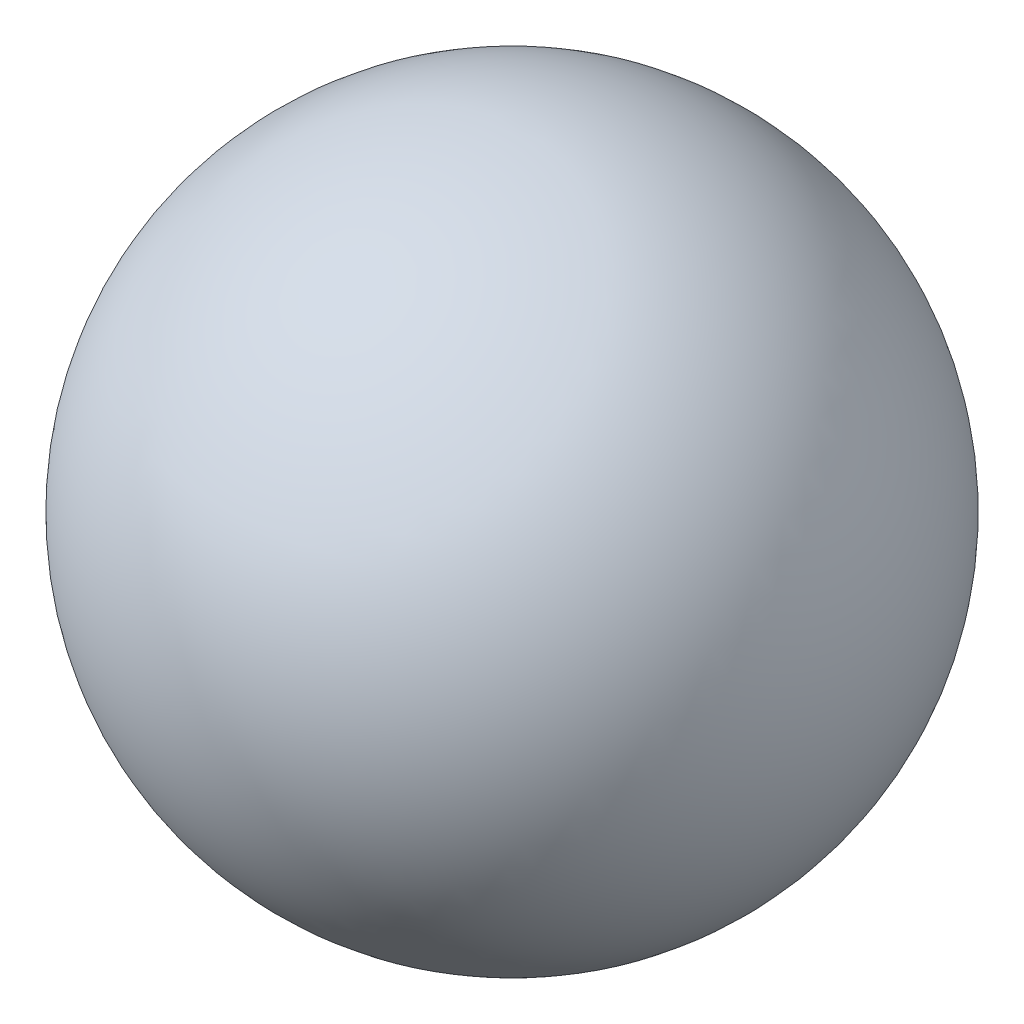
ISO-10303-21;
HEADER;
FILE_DESCRIPTION(('STEP AP214'),'2;1');
FILE_NAME('part.step','',(''),(''),'','','');
FILE_SCHEMA(('AUTOMOTIVE_DESIGN { 1 0 10303 214 1 1 1 1 }'));
ENDSEC;
DATA;
#1=APPLICATION_CONTEXT('core data for automotive mechanical design processes');
#2=APPLICATION_PROTOCOL_DEFINITION('international standard','automotive_design',2000,#1);
#3=PRODUCT_CONTEXT('',#1,'mechanical');
#4=PRODUCT('Part','Part','',(#3));
#5=PRODUCT_RELATED_PRODUCT_CATEGORY('part','',(#4));
#6=PRODUCT_DEFINITION_FORMATION('','',#4);
#7=PRODUCT_DEFINITION_CONTEXT('part definition',#1,'design');
#8=PRODUCT_DEFINITION('design','',#6,#7);
#9=PRODUCT_DEFINITION_SHAPE('','',#8);
#10=(LENGTH_UNIT() NAMED_UNIT(*) SI_UNIT(.MILLI.,.METRE.));
#11=(NAMED_UNIT(*) PLANE_ANGLE_UNIT() SI_UNIT($,.RADIAN.));
#12=(NAMED_UNIT(*) SI_UNIT($,.STERADIAN.) SOLID_ANGLE_UNIT());
#13=UNCERTAINTY_MEASURE_WITH_UNIT(LENGTH_MEASURE(1.E-05),#10,'distance_accuracy_value','');
#14=(GEOMETRIC_REPRESENTATION_CONTEXT(3) GLOBAL_UNCERTAINTY_ASSIGNED_CONTEXT((#13)) GLOBAL_UNIT_ASSIGNED_CONTEXT((#10,
#11,#12)) REPRESENTATION_CONTEXT('',''));
#15=CARTESIAN_POINT('',(0.,0.,0.));
#16=DIRECTION('',(0.,0.,1.));
#17=DIRECTION('',(1.,0.,0.));
#18=AXIS2_PLACEMENT_3D('',#15,#16,#17);
#19=CARTESIAN_POINT('',(0.,0.,0.));
#20=DIRECTION('',(0.,1.,0.));
#21=DIRECTION('',(1.,0.,0.));
#22=AXIS2_PLACEMENT_3D('',#19,#20,#21);
#23=SPHERICAL_SURFACE('',#22,30.);
#24=CARTESIAN_POINT('',(0.,30.,0.));
#25=VERTEX_POINT('',#24);
#26=VERTEX_LOOP('',#25);
#27=FACE_BOUND('',#26,.T.);
#28=ADVANCED_FACE('F35',(#27),#23,.T.);
#29=CLOSED_SHELL('',(#28));
#30=MANIFOLD_SOLID_BREP('B2',#29);
#31=ADVANCED_BREP_SHAPE_REPRESENTATION('',(#18,#30),#14);
#32=SHAPE_DEFINITION_REPRESENTATION(#9,#31);
ENDSEC;
END-ISO-10303-21;
